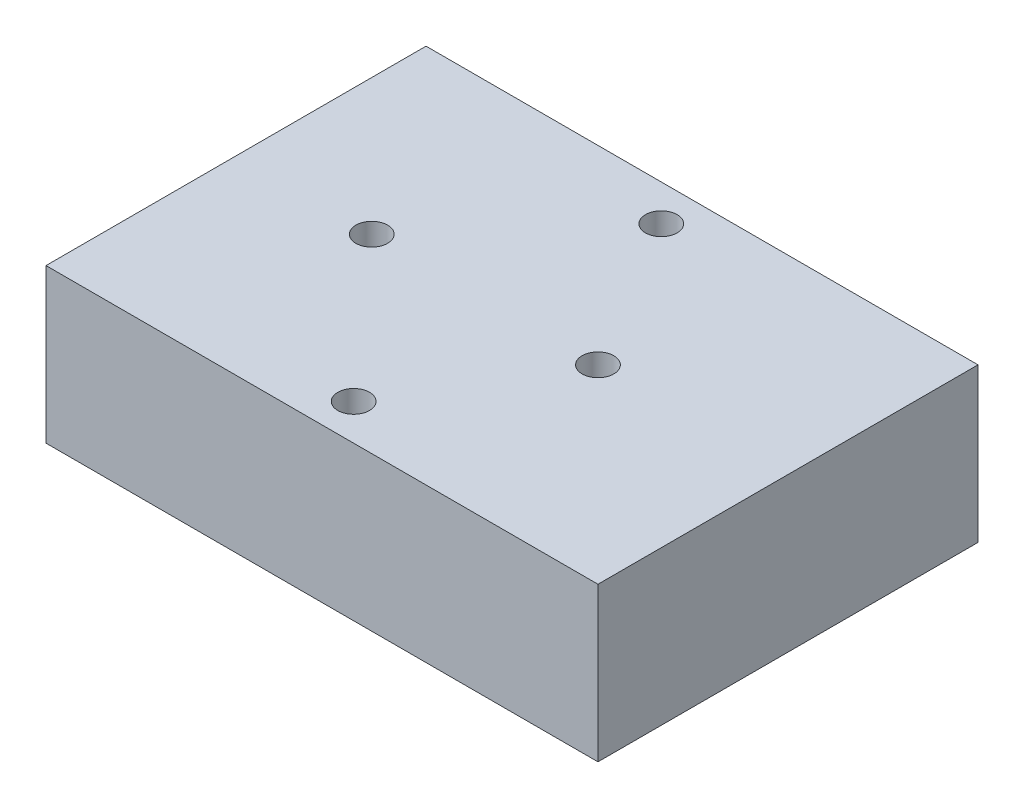
ISO-10303-21;
HEADER;
FILE_DESCRIPTION(('STEP AP214'),'2;1');
FILE_NAME('part.step','',(''),(''),'','','');
FILE_SCHEMA(('AUTOMOTIVE_DESIGN { 1 0 10303 214 1 1 1 1 }'));
ENDSEC;
DATA;
#1=APPLICATION_CONTEXT('core data for automotive mechanical design processes');
#2=APPLICATION_PROTOCOL_DEFINITION('international standard','automotive_design',2000,#1);
#3=PRODUCT_CONTEXT('',#1,'mechanical');
#4=PRODUCT('Part','Part','',(#3));
#5=PRODUCT_RELATED_PRODUCT_CATEGORY('part','',(#4));
#6=PRODUCT_DEFINITION_FORMATION('','',#4);
#7=PRODUCT_DEFINITION_CONTEXT('part definition',#1,'design');
#8=PRODUCT_DEFINITION('design','',#6,#7);
#9=PRODUCT_DEFINITION_SHAPE('','',#8);
#10=(LENGTH_UNIT() NAMED_UNIT(*) SI_UNIT(.MILLI.,.METRE.));
#11=(NAMED_UNIT(*) PLANE_ANGLE_UNIT() SI_UNIT($,.RADIAN.));
#12=(NAMED_UNIT(*) SI_UNIT($,.STERADIAN.) SOLID_ANGLE_UNIT());
#13=UNCERTAINTY_MEASURE_WITH_UNIT(LENGTH_MEASURE(1.E-05),#10,'distance_accuracy_value','');
#14=(GEOMETRIC_REPRESENTATION_CONTEXT(3) GLOBAL_UNCERTAINTY_ASSIGNED_CONTEXT((#13)) GLOBAL_UNIT_ASSIGNED_CONTEXT((#10,
#11,#12)) REPRESENTATION_CONTEXT('',''));
#15=CARTESIAN_POINT('',(0.,0.,0.));
#16=DIRECTION('',(0.,0.,1.));
#17=DIRECTION('',(1.,0.,0.));
#18=AXIS2_PLACEMENT_3D('',#15,#16,#17);
#19=CARTESIAN_POINT('',(30.5,17.,21.));
#20=DIRECTION('',(-1.,0.,0.));
#21=DIRECTION('',(0.,0.,1.));
#22=AXIS2_PLACEMENT_3D('',#19,#20,#21);
#23=PLANE('',#22);
#24=DIRECTION('',(0.,0.,-1.));
#25=VECTOR('',#24,1.);
#26=CARTESIAN_POINT('',(30.5,0.,21.));
#27=LINE('',#26,#25);
#28=CARTESIAN_POINT('',(30.5,0.,21.));
#29=VERTEX_POINT('',#28);
#30=CARTESIAN_POINT('',(30.5,0.,-21.));
#31=VERTEX_POINT('',#30);
#32=EDGE_CURVE('E104',#29,#31,#27,.T.);
#33=ORIENTED_EDGE('',*,*,#32,.T.);
#34=DIRECTION('',(0.,-1.,0.));
#35=VECTOR('',#34,1.);
#36=CARTESIAN_POINT('',(30.5,17.,-21.));
#37=LINE('',#36,#35);
#38=CARTESIAN_POINT('',(30.5,17.,-21.));
#39=VERTEX_POINT('',#38);
#40=EDGE_CURVE('E11',#39,#31,#37,.T.);
#41=ORIENTED_EDGE('',*,*,#40,.F.);
#42=DIRECTION('',(0.,0.,-1.));
#43=VECTOR('',#42,1.);
#44=CARTESIAN_POINT('',(30.5,17.,21.));
#45=LINE('',#44,#43);
#46=CARTESIAN_POINT('',(30.5,17.,21.));
#47=VERTEX_POINT('',#46);
#48=EDGE_CURVE('E92',#47,#39,#45,.T.);
#49=ORIENTED_EDGE('',*,*,#48,.F.);
#50=DIRECTION('',(0.,-1.,0.));
#51=VECTOR('',#50,1.);
#52=CARTESIAN_POINT('',(30.5,17.,21.));
#53=LINE('',#52,#51);
#54=EDGE_CURVE('E100',#47,#29,#53,.T.);
#55=ORIENTED_EDGE('',*,*,#54,.T.);
#56=EDGE_LOOP('',(#33,#41,#49,#55));
#57=FACE_BOUND('',#56,.T.);
#58=ADVANCED_FACE('F41',(#57),#23,.F.);
#59=CARTESIAN_POINT('',(-30.5,17.,-21.));
#60=DIRECTION('',(0.,0.,1.));
#61=DIRECTION('',(1.,0.,0.));
#62=AXIS2_PLACEMENT_3D('',#59,#60,#61);
#63=PLANE('',#62);
#64=DIRECTION('',(-1.,0.,0.));
#65=VECTOR('',#64,1.);
#66=CARTESIAN_POINT('',(-30.5,0.,-21.));
#67=LINE('',#66,#65);
#68=CARTESIAN_POINT('',(-30.5,0.,-21.));
#69=VERTEX_POINT('',#68);
#70=EDGE_CURVE('E96',#31,#69,#67,.T.);
#71=ORIENTED_EDGE('',*,*,#70,.T.);
#72=DIRECTION('',(0.,-1.,0.));
#73=VECTOR('',#72,1.);
#74=CARTESIAN_POINT('',(-30.5,17.,-21.));
#75=LINE('',#74,#73);
#76=CARTESIAN_POINT('',(-30.5,17.,-21.));
#77=VERTEX_POINT('',#76);
#78=EDGE_CURVE('E49',#77,#69,#75,.T.);
#79=ORIENTED_EDGE('',*,*,#78,.F.);
#80=DIRECTION('',(-1.,0.,0.));
#81=VECTOR('',#80,1.);
#82=CARTESIAN_POINT('',(-30.5,17.,-21.));
#83=LINE('',#82,#81);
#84=EDGE_CURVE('E87',#39,#77,#83,.T.);
#85=ORIENTED_EDGE('',*,*,#84,.F.);
#86=ORIENTED_EDGE('',*,*,#40,.T.);
#87=EDGE_LOOP('',(#71,#79,#85,#86));
#88=FACE_BOUND('',#87,.T.);
#89=ADVANCED_FACE('F95',(#88),#63,.F.);
#90=CARTESIAN_POINT('',(-30.5,17.,21.));
#91=DIRECTION('',(1.,0.,0.));
#92=DIRECTION('',(0.,0.,-1.));
#93=AXIS2_PLACEMENT_3D('',#90,#91,#92);
#94=PLANE('',#93);
#95=CARTESIAN_POINT('',(-30.5,8.5,-9.));
#96=DIRECTION('',(-1.,0.,0.));
#97=DIRECTION('',(0.,0.,1.));
#98=AXIS2_PLACEMENT_3D('',#95,#96,#97);
#99=CIRCLE('',#98,2.5);
#100=CARTESIAN_POINT('',(-30.5,8.5,-6.5));
#101=VERTEX_POINT('',#100);
#102=EDGE_CURVE('E148',#101,#101,#99,.T.);
#103=ORIENTED_EDGE('',*,*,#102,.F.);
#104=EDGE_LOOP('',(#103));
#105=FACE_BOUND('',#104,.T.);
#106=CARTESIAN_POINT('',(-30.5,8.5,9.));
#107=DIRECTION('',(-1.,0.,0.));
#108=DIRECTION('',(0.,0.,1.));
#109=AXIS2_PLACEMENT_3D('',#106,#107,#108);
#110=CIRCLE('',#109,2.5);
#111=CARTESIAN_POINT('',(-30.5,8.5,11.5));
#112=VERTEX_POINT('',#111);
#113=EDGE_CURVE('E145',#112,#112,#110,.T.);
#114=ORIENTED_EDGE('',*,*,#113,.F.);
#115=EDGE_LOOP('',(#114));
#116=FACE_BOUND('',#115,.T.);
#117=DIRECTION('',(0.,0.,1.));
#118=VECTOR('',#117,1.);
#119=CARTESIAN_POINT('',(-30.5,0.,21.));
#120=LINE('',#119,#118);
#121=CARTESIAN_POINT('',(-30.5,0.,21.));
#122=VERTEX_POINT('',#121);
#123=EDGE_CURVE('E74',#69,#122,#120,.T.);
#124=ORIENTED_EDGE('',*,*,#123,.T.);
#125=DIRECTION('',(0.,-1.,0.));
#126=VECTOR('',#125,1.);
#127=CARTESIAN_POINT('',(-30.5,17.,21.));
#128=LINE('',#127,#126);
#129=CARTESIAN_POINT('',(-30.5,17.,21.));
#130=VERTEX_POINT('',#129);
#131=EDGE_CURVE('E97',#130,#122,#128,.T.);
#132=ORIENTED_EDGE('',*,*,#131,.F.);
#133=DIRECTION('',(0.,0.,1.));
#134=VECTOR('',#133,1.);
#135=CARTESIAN_POINT('',(-30.5,17.,21.));
#136=LINE('',#135,#134);
#137=EDGE_CURVE('E90',#77,#130,#136,.T.);
#138=ORIENTED_EDGE('',*,*,#137,.F.);
#139=ORIENTED_EDGE('',*,*,#78,.T.);
#140=EDGE_LOOP('',(#124,#132,#138,#139));
#141=FACE_BOUND('',#140,.T.);
#142=ADVANCED_FACE('F98',(#105,#116,#141),#94,.F.);
#143=CARTESIAN_POINT('',(-30.5,17.,21.));
#144=DIRECTION('',(0.,0.,-1.));
#145=DIRECTION('',(-1.,0.,0.));
#146=AXIS2_PLACEMENT_3D('',#143,#144,#145);
#147=PLANE('',#146);
#148=DIRECTION('',(1.,0.,0.));
#149=VECTOR('',#148,1.);
#150=CARTESIAN_POINT('',(-30.5,0.,21.));
#151=LINE('',#150,#149);
#152=EDGE_CURVE('E80',#122,#29,#151,.T.);
#153=ORIENTED_EDGE('',*,*,#152,.T.);
#154=ORIENTED_EDGE('',*,*,#54,.F.);
#155=DIRECTION('',(1.,0.,0.));
#156=VECTOR('',#155,1.);
#157=CARTESIAN_POINT('',(-30.5,17.,21.));
#158=LINE('',#157,#156);
#159=EDGE_CURVE('E57',#130,#47,#158,.T.);
#160=ORIENTED_EDGE('',*,*,#159,.F.);
#161=ORIENTED_EDGE('',*,*,#131,.T.);
#162=EDGE_LOOP('',(#153,#154,#160,#161));
#163=FACE_BOUND('',#162,.T.);
#164=ADVANCED_FACE('F112',(#163),#147,.F.);
#165=CARTESIAN_POINT('',(0.,17.,0.));
#166=DIRECTION('',(0.,-1.,0.));
#167=DIRECTION('',(0.,0.,-1.));
#168=AXIS2_PLACEMENT_3D('',#165,#166,#167);
#169=PLANE('',#168);
#170=CARTESIAN_POINT('',(-0.500000000000007,17.,-17.));
#171=DIRECTION('',(0.,1.,0.));
#172=DIRECTION('',(0.,0.,1.));
#173=AXIS2_PLACEMENT_3D('',#170,#171,#172);
#174=CIRCLE('',#173,1.75);
#175=CARTESIAN_POINT('',(-0.500000000000007,17.,-15.25));
#176=VERTEX_POINT('',#175);
#177=EDGE_CURVE('E137',#176,#176,#174,.T.);
#178=ORIENTED_EDGE('',*,*,#177,.F.);
#179=EDGE_LOOP('',(#178));
#180=FACE_BOUND('',#179,.T.);
#181=CARTESIAN_POINT('',(-0.500000000000004,17.,17.));
#182=DIRECTION('',(0.,1.,0.));
#183=DIRECTION('',(0.,0.,1.));
#184=AXIS2_PLACEMENT_3D('',#181,#182,#183);
#185=CIRCLE('',#184,1.75);
#186=CARTESIAN_POINT('',(-0.500000000000004,17.,18.75));
#187=VERTEX_POINT('',#186);
#188=EDGE_CURVE('E134',#187,#187,#185,.T.);
#189=ORIENTED_EDGE('',*,*,#188,.F.);
#190=EDGE_LOOP('',(#189));
#191=FACE_BOUND('',#190,.T.);
#192=CARTESIAN_POINT('',(-15.5,17.,0.));
#193=DIRECTION('',(0.,1.,0.));
#194=DIRECTION('',(0.,0.,1.));
#195=AXIS2_PLACEMENT_3D('',#192,#193,#194);
#196=CIRCLE('',#195,1.75);
#197=CARTESIAN_POINT('',(-15.5,17.,1.75));
#198=VERTEX_POINT('',#197);
#199=EDGE_CURVE('E128',#198,#198,#196,.T.);
#200=ORIENTED_EDGE('',*,*,#199,.F.);
#201=EDGE_LOOP('',(#200));
#202=FACE_BOUND('',#201,.T.);
#203=CARTESIAN_POINT('',(9.49999999999999,17.,0.));
#204=DIRECTION('',(0.,1.,0.));
#205=DIRECTION('',(0.,0.,1.));
#206=AXIS2_PLACEMENT_3D('',#203,#204,#205);
#207=CIRCLE('',#206,1.75);
#208=CARTESIAN_POINT('',(9.49999999999999,17.,1.75));
#209=VERTEX_POINT('',#208);
#210=EDGE_CURVE('E121',#209,#209,#207,.T.);
#211=ORIENTED_EDGE('',*,*,#210,.F.);
#212=EDGE_LOOP('',(#211));
#213=FACE_BOUND('',#212,.T.);
#214=ORIENTED_EDGE('',*,*,#48,.T.);
#215=ORIENTED_EDGE('',*,*,#84,.T.);
#216=ORIENTED_EDGE('',*,*,#137,.T.);
#217=ORIENTED_EDGE('',*,*,#159,.T.);
#218=EDGE_LOOP('',(#214,#215,#216,#217));
#219=FACE_BOUND('',#218,.T.);
#220=ADVANCED_FACE('F88',(#180,#191,#202,#213,#219),#169,.F.);
#221=CARTESIAN_POINT('',(0.,0.,0.));
#222=DIRECTION('',(0.,-1.,0.));
#223=DIRECTION('',(0.,0.,-1.));
#224=AXIS2_PLACEMENT_3D('',#221,#222,#223);
#225=PLANE('',#224);
#226=CARTESIAN_POINT('',(-0.500000000000007,0.,-17.));
#227=DIRECTION('',(0.,1.,0.));
#228=DIRECTION('',(0.,0.,1.));
#229=AXIS2_PLACEMENT_3D('',#226,#227,#228);
#230=CIRCLE('',#229,1.75);
#231=CARTESIAN_POINT('',(-0.500000000000007,0.,-15.25));
#232=VERTEX_POINT('',#231);
#233=EDGE_CURVE('E107',#232,#232,#230,.T.);
#234=ORIENTED_EDGE('',*,*,#233,.T.);
#235=EDGE_LOOP('',(#234));
#236=FACE_BOUND('',#235,.T.);
#237=CARTESIAN_POINT('',(-0.500000000000004,0.,17.));
#238=DIRECTION('',(0.,1.,0.));
#239=DIRECTION('',(0.,0.,1.));
#240=AXIS2_PLACEMENT_3D('',#237,#238,#239);
#241=CIRCLE('',#240,1.75);
#242=CARTESIAN_POINT('',(-0.500000000000004,0.,18.75));
#243=VERTEX_POINT('',#242);
#244=EDGE_CURVE('E131',#243,#243,#241,.T.);
#245=ORIENTED_EDGE('',*,*,#244,.T.);
#246=EDGE_LOOP('',(#245));
#247=FACE_BOUND('',#246,.T.);
#248=CARTESIAN_POINT('',(-15.5,0.,0.));
#249=DIRECTION('',(0.,1.,0.));
#250=DIRECTION('',(0.,0.,1.));
#251=AXIS2_PLACEMENT_3D('',#248,#249,#250);
#252=CIRCLE('',#251,1.75);
#253=CARTESIAN_POINT('',(-15.5,0.,1.75));
#254=VERTEX_POINT('',#253);
#255=EDGE_CURVE('E125',#254,#254,#252,.T.);
#256=ORIENTED_EDGE('',*,*,#255,.T.);
#257=EDGE_LOOP('',(#256));
#258=FACE_BOUND('',#257,.T.);
#259=CARTESIAN_POINT('',(9.49999999999999,0.,0.));
#260=DIRECTION('',(0.,1.,0.));
#261=DIRECTION('',(0.,0.,1.));
#262=AXIS2_PLACEMENT_3D('',#259,#260,#261);
#263=CIRCLE('',#262,1.75);
#264=CARTESIAN_POINT('',(9.49999999999999,0.,1.75));
#265=VERTEX_POINT('',#264);
#266=EDGE_CURVE('E118',#265,#265,#263,.T.);
#267=ORIENTED_EDGE('',*,*,#266,.T.);
#268=EDGE_LOOP('',(#267));
#269=FACE_BOUND('',#268,.T.);
#270=ORIENTED_EDGE('',*,*,#32,.F.);
#271=ORIENTED_EDGE('',*,*,#152,.F.);
#272=ORIENTED_EDGE('',*,*,#123,.F.);
#273=ORIENTED_EDGE('',*,*,#70,.F.);
#274=EDGE_LOOP('',(#270,#271,#272,#273));
#275=FACE_BOUND('',#274,.T.);
#276=ADVANCED_FACE('F115',(#236,#247,#258,#269,#275),#225,.T.);
#277=CARTESIAN_POINT('',(9.49999999999999,0.,0.));
#278=DIRECTION('',(0.,1.,0.));
#279=DIRECTION('',(0.,0.,1.));
#280=AXIS2_PLACEMENT_3D('',#277,#278,#279);
#281=CYLINDRICAL_SURFACE('',#280,1.75);
#282=ORIENTED_EDGE('',*,*,#266,.F.);
#283=EDGE_LOOP('',(#282));
#284=FACE_BOUND('',#283,.T.);
#285=ORIENTED_EDGE('',*,*,#210,.T.);
#286=EDGE_LOOP('',(#285));
#287=FACE_BOUND('',#286,.T.);
#288=ADVANCED_FACE('F194',(#284,#287),#281,.F.);
#289=CARTESIAN_POINT('',(-15.5,0.,0.));
#290=DIRECTION('',(0.,1.,0.));
#291=DIRECTION('',(0.,0.,1.));
#292=AXIS2_PLACEMENT_3D('',#289,#290,#291);
#293=CYLINDRICAL_SURFACE('',#292,1.75);
#294=ORIENTED_EDGE('',*,*,#255,.F.);
#295=EDGE_LOOP('',(#294));
#296=FACE_BOUND('',#295,.T.);
#297=ORIENTED_EDGE('',*,*,#199,.T.);
#298=EDGE_LOOP('',(#297));
#299=FACE_BOUND('',#298,.T.);
#300=ADVANCED_FACE('F201',(#296,#299),#293,.F.);
#301=CARTESIAN_POINT('',(-0.500000000000004,0.,17.));
#302=DIRECTION('',(0.,1.,0.));
#303=DIRECTION('',(0.,0.,1.));
#304=AXIS2_PLACEMENT_3D('',#301,#302,#303);
#305=CYLINDRICAL_SURFACE('',#304,1.75);
#306=ORIENTED_EDGE('',*,*,#244,.F.);
#307=EDGE_LOOP('',(#306));
#308=FACE_BOUND('',#307,.T.);
#309=ORIENTED_EDGE('',*,*,#188,.T.);
#310=EDGE_LOOP('',(#309));
#311=FACE_BOUND('',#310,.T.);
#312=ADVANCED_FACE('F179',(#308,#311),#305,.F.);
#313=CARTESIAN_POINT('',(-0.500000000000007,0.,-17.));
#314=DIRECTION('',(0.,1.,0.));
#315=DIRECTION('',(0.,0.,1.));
#316=AXIS2_PLACEMENT_3D('',#313,#314,#315);
#317=CYLINDRICAL_SURFACE('',#316,1.75);
#318=ORIENTED_EDGE('',*,*,#233,.F.);
#319=EDGE_LOOP('',(#318));
#320=FACE_BOUND('',#319,.T.);
#321=ORIENTED_EDGE('',*,*,#177,.T.);
#322=EDGE_LOOP('',(#321));
#323=FACE_BOUND('',#322,.T.);
#324=ADVANCED_FACE('F170',(#320,#323),#317,.F.);
#325=CARTESIAN_POINT('',(14.5,8.5,9.));
#326=DIRECTION('',(-1.,0.,0.));
#327=DIRECTION('',(0.,0.,1.));
#328=AXIS2_PLACEMENT_3D('',#325,#326,#327);
#329=CYLINDRICAL_SURFACE('',#328,2.5);
#330=CARTESIAN_POINT('',(14.5,8.5,9.));
#331=DIRECTION('',(-1.,0.,0.));
#332=DIRECTION('',(0.,0.,1.));
#333=AXIS2_PLACEMENT_3D('',#330,#331,#332);
#334=CIRCLE('',#333,2.5);
#335=CARTESIAN_POINT('',(14.5,8.5,11.5));
#336=VERTEX_POINT('',#335);
#337=EDGE_CURVE('E142',#336,#336,#334,.T.);
#338=CARTESIAN_POINT('',(14.5,8.5,11.5));
#339=CARTESIAN_POINT('',(14.03125,8.5,11.5));
#340=CARTESIAN_POINT('',(13.5625,8.5,11.5));
#341=CARTESIAN_POINT('',(12.625,8.5,11.5));
#342=CARTESIAN_POINT('',(12.15625,8.5,11.5));
#343=CARTESIAN_POINT('',(11.21875,8.5,11.5));
#344=CARTESIAN_POINT('',(10.75,8.5,11.5));
#345=CARTESIAN_POINT('',(9.8125,8.5,11.5));
#346=CARTESIAN_POINT('',(9.34375,8.5,11.5));
#347=CARTESIAN_POINT('',(8.40625,8.5,11.5));
#348=CARTESIAN_POINT('',(7.9375,8.5,11.5));
#349=CARTESIAN_POINT('',(7.,8.5,11.5));
#350=CARTESIAN_POINT('',(6.53125,8.5,11.5));
#351=CARTESIAN_POINT('',(5.59375,8.5,11.5));
#352=CARTESIAN_POINT('',(5.125,8.5,11.5));
#353=CARTESIAN_POINT('',(4.1875,8.5,11.5));
#354=CARTESIAN_POINT('',(3.71875,8.5,11.5));
#355=CARTESIAN_POINT('',(2.78125,8.5,11.5));
#356=CARTESIAN_POINT('',(2.3125,8.5,11.5));
#357=CARTESIAN_POINT('',(1.375,8.5,11.5));
#358=CARTESIAN_POINT('',(0.906250000000004,8.5,11.5));
#359=CARTESIAN_POINT('',(-0.0312499999999966,8.5,11.5));
#360=CARTESIAN_POINT('',(-0.499999999999997,8.5,11.5));
#361=CARTESIAN_POINT('',(-1.4375,8.5,11.5));
#362=CARTESIAN_POINT('',(-1.90625,8.5,11.5));
#363=CARTESIAN_POINT('',(-2.84375,8.5,11.5));
#364=CARTESIAN_POINT('',(-3.3125,8.5,11.5));
#365=CARTESIAN_POINT('',(-4.25,8.5,11.5));
#366=CARTESIAN_POINT('',(-4.71875,8.5,11.5));
#367=CARTESIAN_POINT('',(-5.65625,8.5,11.5));
#368=CARTESIAN_POINT('',(-6.125,8.5,11.5));
#369=CARTESIAN_POINT('',(-7.0625,8.5,11.5));
#370=CARTESIAN_POINT('',(-7.53125,8.5,11.5));
#371=CARTESIAN_POINT('',(-8.46875,8.5,11.5));
#372=CARTESIAN_POINT('',(-8.9375,8.5,11.5));
#373=CARTESIAN_POINT('',(-9.875,8.5,11.5));
#374=CARTESIAN_POINT('',(-10.34375,8.5,11.5));
#375=CARTESIAN_POINT('',(-11.28125,8.5,11.5));
#376=CARTESIAN_POINT('',(-11.75,8.5,11.5));
#377=CARTESIAN_POINT('',(-12.6875,8.5,11.5));
#378=CARTESIAN_POINT('',(-13.15625,8.5,11.5));
#379=CARTESIAN_POINT('',(-14.09375,8.5,11.5));
#380=CARTESIAN_POINT('',(-14.5625,8.5,11.5));
#381=CARTESIAN_POINT('',(-15.5,8.5,11.5));
#382=CARTESIAN_POINT('',(-15.96875,8.5,11.5));
#383=CARTESIAN_POINT('',(-16.90625,8.5,11.5));
#384=CARTESIAN_POINT('',(-17.375,8.5,11.5));
#385=CARTESIAN_POINT('',(-18.3125,8.5,11.5));
#386=CARTESIAN_POINT('',(-18.78125,8.5,11.5));
#387=CARTESIAN_POINT('',(-19.71875,8.5,11.5));
#388=CARTESIAN_POINT('',(-20.1875,8.5,11.5));
#389=CARTESIAN_POINT('',(-21.125,8.5,11.5));
#390=CARTESIAN_POINT('',(-21.59375,8.5,11.5));
#391=CARTESIAN_POINT('',(-22.53125,8.5,11.5));
#392=CARTESIAN_POINT('',(-23.,8.5,11.5));
#393=CARTESIAN_POINT('',(-23.9375,8.5,11.5));
#394=CARTESIAN_POINT('',(-24.40625,8.5,11.5));
#395=CARTESIAN_POINT('',(-25.34375,8.5,11.5));
#396=CARTESIAN_POINT('',(-25.8125,8.5,11.5));
#397=CARTESIAN_POINT('',(-26.75,8.5,11.5));
#398=CARTESIAN_POINT('',(-27.21875,8.5,11.5));
#399=CARTESIAN_POINT('',(-28.15625,8.5,11.5));
#400=CARTESIAN_POINT('',(-28.625,8.5,11.5));
#401=CARTESIAN_POINT('',(-29.5625,8.5,11.5));
#402=CARTESIAN_POINT('',(-30.03125,8.5,11.5));
#403=CARTESIAN_POINT('',(-30.5,8.5,11.5));
#404=B_SPLINE_CURVE_WITH_KNOTS('',3,(#338,#339,#340,#341,#342,#343,#344,#345,#346,#347,#348,
#349,#350,#351,#352,#353,#354,#355,#356,#357,#358,#359,#360,#361,#362,#363,#364,#365,#366,#367,
#368,#369,#370,#371,#372,#373,#374,#375,#376,#377,#378,#379,#380,#381,#382,#383,#384,#385,#386,
#387,#388,#389,#390,#391,#392,#393,#394,#395,#396,#397,#398,#399,#400,#401,#402,#403),
.UNSPECIFIED.,.F.,.F.,(4,2,2,2,2,2,2,2,2,2,2,2,2,2,2,2,2,2,2,2,2,2,2,2,2,2,2,2,2,2,2,2,4),(0.,
1.40625,2.8125,4.21875,5.625,7.03125,8.4375,9.84375,11.25,12.65625,14.0625,15.46875,16.875,
18.28125,19.6875,21.09375,22.5,23.90625,25.3125,26.71875,28.125,29.53125,30.9375,32.34375,33.75,
35.15625,36.5625,37.96875,39.375,40.78125,42.1875,43.59375,45.),.UNSPECIFIED.);
#405=EDGE_CURVE('BSEAM168',#336,#112,#404,.T.);
#406=ORIENTED_EDGE('',*,*,#337,.F.);
#407=ORIENTED_EDGE('',*,*,#113,.T.);
#408=ORIENTED_EDGE('',*,*,#405,.T.);
#409=ORIENTED_EDGE('',*,*,#405,.F.);
#410=EDGE_LOOP('',(#406,#408,#407,#409));
#411=FACE_BOUND('',#410,.T.);
#412=ADVANCED_FACE('F168',(#411),#329,.F.);
#413=CARTESIAN_POINT('',(14.5,8.5,9.));
#414=DIRECTION('',(-1.,0.,0.));
#415=DIRECTION('',(0.,0.,1.));
#416=AXIS2_PLACEMENT_3D('',#413,#414,#415);
#417=PLANE('',#416);
#418=ORIENTED_EDGE('',*,*,#337,.T.);
#419=EDGE_LOOP('',(#418));
#420=FACE_BOUND('',#419,.T.);
#421=ADVANCED_FACE('F159',(#420),#417,.T.);
#422=CARTESIAN_POINT('',(14.5,8.5,-9.));
#423=DIRECTION('',(-1.,0.,0.));
#424=DIRECTION('',(0.,0.,1.));
#425=AXIS2_PLACEMENT_3D('',#422,#423,#424);
#426=CYLINDRICAL_SURFACE('',#425,2.5);
#427=CARTESIAN_POINT('',(14.5,8.5,-9.));
#428=DIRECTION('',(-1.,0.,0.));
#429=DIRECTION('',(0.,0.,1.));
#430=AXIS2_PLACEMENT_3D('',#427,#428,#429);
#431=CIRCLE('',#430,2.5);
#432=CARTESIAN_POINT('',(14.5,8.5,-6.5));
#433=VERTEX_POINT('',#432);
#434=EDGE_CURVE('E122',#433,#433,#431,.T.);
#435=CARTESIAN_POINT('',(14.5,8.5,-6.5));
#436=CARTESIAN_POINT('',(14.03125,8.5,-6.5));
#437=CARTESIAN_POINT('',(13.5625,8.5,-6.5));
#438=CARTESIAN_POINT('',(12.625,8.5,-6.5));
#439=CARTESIAN_POINT('',(12.15625,8.5,-6.5));
#440=CARTESIAN_POINT('',(11.21875,8.5,-6.5));
#441=CARTESIAN_POINT('',(10.75,8.5,-6.5));
#442=CARTESIAN_POINT('',(9.8125,8.5,-6.5));
#443=CARTESIAN_POINT('',(9.34375,8.5,-6.5));
#444=CARTESIAN_POINT('',(8.40625,8.5,-6.5));
#445=CARTESIAN_POINT('',(7.9375,8.5,-6.5));
#446=CARTESIAN_POINT('',(7.,8.5,-6.5));
#447=CARTESIAN_POINT('',(6.53125,8.5,-6.5));
#448=CARTESIAN_POINT('',(5.59375,8.5,-6.5));
#449=CARTESIAN_POINT('',(5.125,8.5,-6.5));
#450=CARTESIAN_POINT('',(4.1875,8.5,-6.5));
#451=CARTESIAN_POINT('',(3.71875,8.5,-6.5));
#452=CARTESIAN_POINT('',(2.78125,8.5,-6.5));
#453=CARTESIAN_POINT('',(2.3125,8.5,-6.5));
#454=CARTESIAN_POINT('',(1.375,8.5,-6.5));
#455=CARTESIAN_POINT('',(0.906250000000004,8.5,-6.5));
#456=CARTESIAN_POINT('',(-0.0312499999999966,8.5,-6.5));
#457=CARTESIAN_POINT('',(-0.499999999999997,8.5,-6.5));
#458=CARTESIAN_POINT('',(-1.4375,8.5,-6.5));
#459=CARTESIAN_POINT('',(-1.90625,8.5,-6.5));
#460=CARTESIAN_POINT('',(-2.84375,8.5,-6.5));
#461=CARTESIAN_POINT('',(-3.3125,8.5,-6.5));
#462=CARTESIAN_POINT('',(-4.25,8.5,-6.5));
#463=CARTESIAN_POINT('',(-4.71875,8.5,-6.5));
#464=CARTESIAN_POINT('',(-5.65625,8.5,-6.5));
#465=CARTESIAN_POINT('',(-6.125,8.5,-6.5));
#466=CARTESIAN_POINT('',(-7.0625,8.5,-6.5));
#467=CARTESIAN_POINT('',(-7.53125,8.5,-6.5));
#468=CARTESIAN_POINT('',(-8.46875,8.5,-6.5));
#469=CARTESIAN_POINT('',(-8.9375,8.5,-6.5));
#470=CARTESIAN_POINT('',(-9.875,8.5,-6.5));
#471=CARTESIAN_POINT('',(-10.34375,8.5,-6.5));
#472=CARTESIAN_POINT('',(-11.28125,8.5,-6.5));
#473=CARTESIAN_POINT('',(-11.75,8.5,-6.5));
#474=CARTESIAN_POINT('',(-12.6875,8.5,-6.5));
#475=CARTESIAN_POINT('',(-13.15625,8.5,-6.5));
#476=CARTESIAN_POINT('',(-14.09375,8.5,-6.5));
#477=CARTESIAN_POINT('',(-14.5625,8.5,-6.5));
#478=CARTESIAN_POINT('',(-15.5,8.5,-6.5));
#479=CARTESIAN_POINT('',(-15.96875,8.5,-6.5));
#480=CARTESIAN_POINT('',(-16.90625,8.5,-6.5));
#481=CARTESIAN_POINT('',(-17.375,8.5,-6.5));
#482=CARTESIAN_POINT('',(-18.3125,8.5,-6.5));
#483=CARTESIAN_POINT('',(-18.78125,8.5,-6.5));
#484=CARTESIAN_POINT('',(-19.71875,8.5,-6.5));
#485=CARTESIAN_POINT('',(-20.1875,8.5,-6.5));
#486=CARTESIAN_POINT('',(-21.125,8.5,-6.5));
#487=CARTESIAN_POINT('',(-21.59375,8.5,-6.5));
#488=CARTESIAN_POINT('',(-22.53125,8.5,-6.5));
#489=CARTESIAN_POINT('',(-23.,8.5,-6.5));
#490=CARTESIAN_POINT('',(-23.9375,8.5,-6.5));
#491=CARTESIAN_POINT('',(-24.40625,8.5,-6.5));
#492=CARTESIAN_POINT('',(-25.34375,8.5,-6.5));
#493=CARTESIAN_POINT('',(-25.8125,8.5,-6.5));
#494=CARTESIAN_POINT('',(-26.75,8.5,-6.5));
#495=CARTESIAN_POINT('',(-27.21875,8.5,-6.5));
#496=CARTESIAN_POINT('',(-28.15625,8.5,-6.5));
#497=CARTESIAN_POINT('',(-28.625,8.5,-6.5));
#498=CARTESIAN_POINT('',(-29.5625,8.5,-6.5));
#499=CARTESIAN_POINT('',(-30.03125,8.5,-6.5));
#500=CARTESIAN_POINT('',(-30.5,8.5,-6.5));
#501=B_SPLINE_CURVE_WITH_KNOTS('',3,(#435,#436,#437,#438,#439,#440,#441,#442,#443,#444,#445,
#446,#447,#448,#449,#450,#451,#452,#453,#454,#455,#456,#457,#458,#459,#460,#461,#462,#463,#464,
#465,#466,#467,#468,#469,#470,#471,#472,#473,#474,#475,#476,#477,#478,#479,#480,#481,#482,#483,
#484,#485,#486,#487,#488,#489,#490,#491,#492,#493,#494,#495,#496,#497,#498,#499,#500),
.UNSPECIFIED.,.F.,.F.,(4,2,2,2,2,2,2,2,2,2,2,2,2,2,2,2,2,2,2,2,2,2,2,2,2,2,2,2,2,2,2,2,4),(0.,
1.40625,2.8125,4.21875,5.625,7.03125,8.4375,9.84375,11.25,12.65625,14.0625,15.46875,16.875,
18.28125,19.6875,21.09375,22.5,23.90625,25.3125,26.71875,28.125,29.53125,30.9375,32.34375,33.75,
35.15625,36.5625,37.96875,39.375,40.78125,42.1875,43.59375,45.),.UNSPECIFIED.);
#502=EDGE_CURVE('BSEAM156',#433,#101,#501,.T.);
#503=ORIENTED_EDGE('',*,*,#434,.F.);
#504=ORIENTED_EDGE('',*,*,#102,.T.);
#505=ORIENTED_EDGE('',*,*,#502,.T.);
#506=ORIENTED_EDGE('',*,*,#502,.F.);
#507=EDGE_LOOP('',(#503,#505,#504,#506));
#508=FACE_BOUND('',#507,.T.);
#509=ADVANCED_FACE('F156',(#508),#426,.F.);
#510=CARTESIAN_POINT('',(14.5,8.5,-9.));
#511=DIRECTION('',(-1.,0.,0.));
#512=DIRECTION('',(0.,0.,1.));
#513=AXIS2_PLACEMENT_3D('',#510,#511,#512);
#514=PLANE('',#513);
#515=ORIENTED_EDGE('',*,*,#434,.T.);
#516=EDGE_LOOP('',(#515));
#517=FACE_BOUND('',#516,.T.);
#518=ADVANCED_FACE('F154',(#517),#514,.T.);
#519=CLOSED_SHELL('',(#58,#89,#142,#164,#220,#276,#288,#300,#312,#324,#412,#421,#509,#518));
#520=MANIFOLD_SOLID_BREP('B2',#519);
#521=ADVANCED_BREP_SHAPE_REPRESENTATION('',(#18,#520),#14);
#522=SHAPE_DEFINITION_REPRESENTATION(#9,#521);
ENDSEC;
END-ISO-10303-21;
